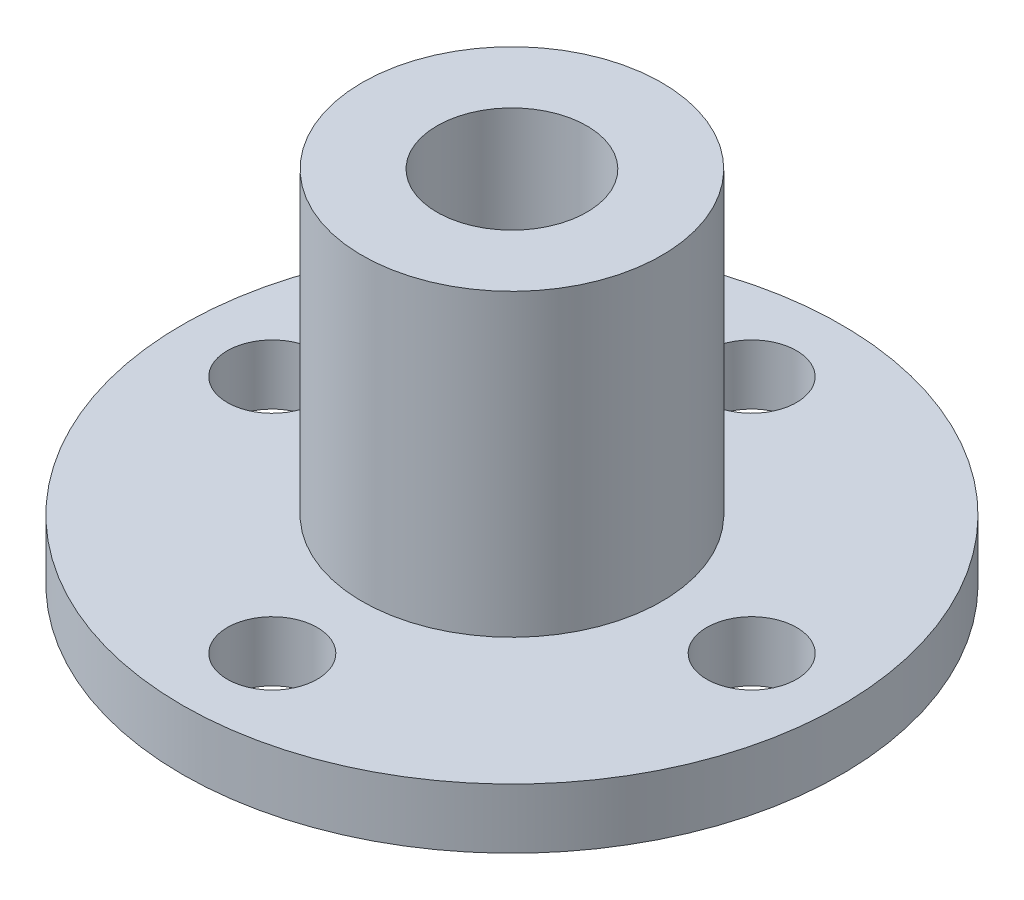
ISO-10303-21;
HEADER;
FILE_DESCRIPTION(('STEP AP214'),'2;1');
FILE_NAME('part.step','',(''),(''),'','','');
FILE_SCHEMA(('AUTOMOTIVE_DESIGN { 1 0 10303 214 1 1 1 1 }'));
ENDSEC;
DATA;
#1=APPLICATION_CONTEXT('core data for automotive mechanical design processes');
#2=APPLICATION_PROTOCOL_DEFINITION('international standard','automotive_design',2000,#1);
#3=PRODUCT_CONTEXT('',#1,'mechanical');
#4=PRODUCT('Part','Part','',(#3));
#5=PRODUCT_RELATED_PRODUCT_CATEGORY('part','',(#4));
#6=PRODUCT_DEFINITION_FORMATION('','',#4);
#7=PRODUCT_DEFINITION_CONTEXT('part definition',#1,'design');
#8=PRODUCT_DEFINITION('design','',#6,#7);
#9=PRODUCT_DEFINITION_SHAPE('','',#8);
#10=(LENGTH_UNIT() NAMED_UNIT(*) SI_UNIT(.MILLI.,.METRE.));
#11=(NAMED_UNIT(*) PLANE_ANGLE_UNIT() SI_UNIT($,.RADIAN.));
#12=(NAMED_UNIT(*) SI_UNIT($,.STERADIAN.) SOLID_ANGLE_UNIT());
#13=UNCERTAINTY_MEASURE_WITH_UNIT(LENGTH_MEASURE(1.E-05),#10,'distance_accuracy_value','');
#14=(GEOMETRIC_REPRESENTATION_CONTEXT(3) GLOBAL_UNCERTAINTY_ASSIGNED_CONTEXT((#13)) GLOBAL_UNIT_ASSIGNED_CONTEXT((#10,
#11,#12)) REPRESENTATION_CONTEXT('',''));
#15=CARTESIAN_POINT('',(0.,0.,0.));
#16=DIRECTION('',(0.,0.,1.));
#17=DIRECTION('',(1.,0.,0.));
#18=AXIS2_PLACEMENT_3D('',#15,#16,#17);
#19=CARTESIAN_POINT('',(0.,2.,0.));
#20=DIRECTION('',(0.,-1.,0.));
#21=DIRECTION('',(0.,0.,-1.));
#22=AXIS2_PLACEMENT_3D('',#19,#20,#21);
#23=CYLINDRICAL_SURFACE('',#22,11.);
#24=CARTESIAN_POINT('',(0.,2.,0.));
#25=DIRECTION('',(0.,1.,0.));
#26=DIRECTION('',(0.,0.,1.));
#27=AXIS2_PLACEMENT_3D('',#24,#25,#26);
#28=CIRCLE('',#27,11.);
#29=CARTESIAN_POINT('',(0.,2.,11.));
#30=VERTEX_POINT('',#29);
#31=EDGE_CURVE('E44',#30,#30,#28,.T.);
#32=ORIENTED_EDGE('',*,*,#31,.F.);
#33=EDGE_LOOP('',(#32));
#34=FACE_BOUND('',#33,.T.);
#35=CARTESIAN_POINT('',(0.,0.,0.));
#36=DIRECTION('',(0.,1.,0.));
#37=DIRECTION('',(0.,0.,1.));
#38=AXIS2_PLACEMENT_3D('',#35,#36,#37);
#39=CIRCLE('',#38,11.);
#40=CARTESIAN_POINT('',(0.,0.,11.));
#41=VERTEX_POINT('',#40);
#42=EDGE_CURVE('E49',#41,#41,#39,.T.);
#43=ORIENTED_EDGE('',*,*,#42,.T.);
#44=EDGE_LOOP('',(#43));
#45=FACE_BOUND('',#44,.T.);
#46=ADVANCED_FACE('F37',(#34,#45),#23,.T.);
#47=CARTESIAN_POINT('',(0.,2.,0.));
#48=DIRECTION('',(0.,1.,0.));
#49=DIRECTION('',(0.,0.,1.));
#50=AXIS2_PLACEMENT_3D('',#47,#48,#49);
#51=PLANE('',#50);
#52=CARTESIAN_POINT('',(-8.,2.,0.));
#53=DIRECTION('',(0.,1.,0.));
#54=DIRECTION('',(-1.,0.,0.));
#55=AXIS2_PLACEMENT_3D('',#52,#53,#54);
#56=CIRCLE('',#55,1.5);
#57=CARTESIAN_POINT('',(-9.5,2.,0.));
#58=VERTEX_POINT('',#57);
#59=EDGE_CURVE('E61',#58,#58,#56,.T.);
#60=ORIENTED_EDGE('',*,*,#59,.F.);
#61=EDGE_LOOP('',(#60));
#62=FACE_BOUND('',#61,.T.);
#63=CARTESIAN_POINT('',(-0.000999999999972068,2.,-8.001));
#64=DIRECTION('',(0.,1.,0.));
#65=DIRECTION('',(-1.,0.,0.));
#66=AXIS2_PLACEMENT_3D('',#63,#64,#65);
#67=CIRCLE('',#66,1.5);
#68=CARTESIAN_POINT('',(-1.50099999999997,2.,-8.001));
#69=VERTEX_POINT('',#68);
#70=EDGE_CURVE('E108',#69,#69,#67,.T.);
#71=ORIENTED_EDGE('',*,*,#70,.F.);
#72=EDGE_LOOP('',(#71));
#73=FACE_BOUND('',#72,.T.);
#74=CARTESIAN_POINT('',(8.,2.,-0.00199999999994414));
#75=DIRECTION('',(0.,1.,0.));
#76=DIRECTION('',(-1.,0.,0.));
#77=AXIS2_PLACEMENT_3D('',#74,#75,#76);
#78=CIRCLE('',#77,1.5);
#79=CARTESIAN_POINT('',(6.5,2.,-0.00199999999994414));
#80=VERTEX_POINT('',#79);
#81=EDGE_CURVE('E112',#80,#80,#78,.T.);
#82=ORIENTED_EDGE('',*,*,#81,.F.);
#83=EDGE_LOOP('',(#82));
#84=FACE_BOUND('',#83,.T.);
#85=CARTESIAN_POINT('',(0.000999999999916204,2.,7.999));
#86=DIRECTION('',(0.,1.,0.));
#87=DIRECTION('',(-1.,0.,0.));
#88=AXIS2_PLACEMENT_3D('',#85,#86,#87);
#89=CIRCLE('',#88,1.5);
#90=CARTESIAN_POINT('',(-1.49900000000008,2.,7.999));
#91=VERTEX_POINT('',#90);
#92=EDGE_CURVE('E116',#91,#91,#89,.T.);
#93=ORIENTED_EDGE('',*,*,#92,.F.);
#94=EDGE_LOOP('',(#93));
#95=FACE_BOUND('',#94,.T.);
#96=CARTESIAN_POINT('',(0.,2.,0.));
#97=DIRECTION('',(0.,1.,0.));
#98=DIRECTION('',(-1.,0.,0.));
#99=AXIS2_PLACEMENT_3D('',#96,#97,#98);
#100=CIRCLE('',#99,5.);
#101=CARTESIAN_POINT('',(-5.,2.,0.));
#102=VERTEX_POINT('',#101);
#103=EDGE_CURVE('E10',#102,#102,#100,.T.);
#104=ORIENTED_EDGE('',*,*,#103,.F.);
#105=EDGE_LOOP('',(#104));
#106=FACE_BOUND('',#105,.T.);
#107=ORIENTED_EDGE('',*,*,#31,.T.);
#108=EDGE_LOOP('',(#107));
#109=FACE_BOUND('',#108,.T.);
#110=ADVANCED_FACE('F86',(#62,#73,#84,#95,#106,#109),#51,.T.);
#111=CARTESIAN_POINT('',(0.,0.,0.));
#112=DIRECTION('',(0.,1.,0.));
#113=DIRECTION('',(0.,0.,1.));
#114=AXIS2_PLACEMENT_3D('',#111,#112,#113);
#115=PLANE('',#114);
#116=CARTESIAN_POINT('',(0.,0.,0.));
#117=DIRECTION('',(0.,1.,0.));
#118=DIRECTION('',(-1.,0.,0.));
#119=AXIS2_PLACEMENT_3D('',#116,#117,#118);
#120=CIRCLE('',#119,2.5);
#121=CARTESIAN_POINT('',(-2.5,0.,0.));
#122=VERTEX_POINT('',#121);
#123=EDGE_CURVE('E118',#122,#122,#120,.T.);
#124=ORIENTED_EDGE('',*,*,#123,.T.);
#125=EDGE_LOOP('',(#124));
#126=FACE_BOUND('',#125,.T.);
#127=CARTESIAN_POINT('',(-8.,0.,0.));
#128=DIRECTION('',(0.,1.,0.));
#129=DIRECTION('',(0.,0.,1.));
#130=AXIS2_PLACEMENT_3D('',#127,#128,#129);
#131=CIRCLE('',#130,1.5);
#132=CARTESIAN_POINT('',(-8.,0.,1.5));
#133=VERTEX_POINT('',#132);
#134=EDGE_CURVE('E40',#133,#133,#131,.T.);
#135=ORIENTED_EDGE('',*,*,#134,.T.);
#136=EDGE_LOOP('',(#135));
#137=FACE_BOUND('',#136,.T.);
#138=CARTESIAN_POINT('',(-0.000999999999972191,0.,-8.001));
#139=DIRECTION('',(0.,1.,0.));
#140=DIRECTION('',(0.,0.,1.));
#141=AXIS2_PLACEMENT_3D('',#138,#139,#140);
#142=CIRCLE('',#141,1.5);
#143=CARTESIAN_POINT('',(-0.000999999999972191,0.,-6.501));
#144=VERTEX_POINT('',#143);
#145=EDGE_CURVE('E63',#144,#144,#142,.T.);
#146=ORIENTED_EDGE('',*,*,#145,.T.);
#147=EDGE_LOOP('',(#146));
#148=FACE_BOUND('',#147,.T.);
#149=CARTESIAN_POINT('',(8.,0.,-0.00199999999994414));
#150=DIRECTION('',(0.,1.,0.));
#151=DIRECTION('',(0.,0.,1.));
#152=AXIS2_PLACEMENT_3D('',#149,#150,#151);
#153=CIRCLE('',#152,1.5);
#154=CARTESIAN_POINT('',(8.,0.,1.49800000000006));
#155=VERTEX_POINT('',#154);
#156=EDGE_CURVE('E60',#155,#155,#153,.T.);
#157=ORIENTED_EDGE('',*,*,#156,.T.);
#158=EDGE_LOOP('',(#157));
#159=FACE_BOUND('',#158,.T.);
#160=CARTESIAN_POINT('',(0.000999999999916082,0.,7.999));
#161=DIRECTION('',(0.,1.,0.));
#162=DIRECTION('',(0.,0.,1.));
#163=AXIS2_PLACEMENT_3D('',#160,#161,#162);
#164=CIRCLE('',#163,1.5);
#165=CARTESIAN_POINT('',(0.000999999999916082,0.,9.499));
#166=VERTEX_POINT('',#165);
#167=EDGE_CURVE('E57',#166,#166,#164,.T.);
#168=ORIENTED_EDGE('',*,*,#167,.T.);
#169=EDGE_LOOP('',(#168));
#170=FACE_BOUND('',#169,.T.);
#171=ORIENTED_EDGE('',*,*,#42,.F.);
#172=EDGE_LOOP('',(#171));
#173=FACE_BOUND('',#172,.T.);
#174=ADVANCED_FACE('F77',(#126,#137,#148,#159,#170,#173),#115,.F.);
#175=CARTESIAN_POINT('',(0.,12.,0.));
#176=DIRECTION('',(0.,-1.,0.));
#177=DIRECTION('',(1.,0.,0.));
#178=AXIS2_PLACEMENT_3D('',#175,#176,#177);
#179=CYLINDRICAL_SURFACE('',#178,5.);
#180=CARTESIAN_POINT('',(0.,12.,0.));
#181=DIRECTION('',(0.,1.,0.));
#182=DIRECTION('',(-1.,0.,0.));
#183=AXIS2_PLACEMENT_3D('',#180,#181,#182);
#184=CIRCLE('',#183,5.);
#185=CARTESIAN_POINT('',(-5.,12.,0.));
#186=VERTEX_POINT('',#185);
#187=EDGE_CURVE('E52',#186,#186,#184,.T.);
#188=ORIENTED_EDGE('',*,*,#187,.F.);
#189=EDGE_LOOP('',(#188));
#190=FACE_BOUND('',#189,.T.);
#191=ORIENTED_EDGE('',*,*,#103,.T.);
#192=EDGE_LOOP('',(#191));
#193=FACE_BOUND('',#192,.T.);
#194=ADVANCED_FACE('F75',(#190,#193),#179,.T.);
#195=CARTESIAN_POINT('',(0.,12.,0.));
#196=DIRECTION('',(0.,1.,0.));
#197=DIRECTION('',(-1.,0.,0.));
#198=AXIS2_PLACEMENT_3D('',#195,#196,#197);
#199=PLANE('',#198);
#200=CARTESIAN_POINT('',(0.,12.,0.));
#201=DIRECTION('',(0.,1.,0.));
#202=DIRECTION('',(-1.,0.,0.));
#203=AXIS2_PLACEMENT_3D('',#200,#201,#202);
#204=CIRCLE('',#203,2.5);
#205=CARTESIAN_POINT('',(-2.5,12.,0.));
#206=VERTEX_POINT('',#205);
#207=EDGE_CURVE('E121',#206,#206,#204,.T.);
#208=ORIENTED_EDGE('',*,*,#207,.F.);
#209=EDGE_LOOP('',(#208));
#210=FACE_BOUND('',#209,.T.);
#211=ORIENTED_EDGE('',*,*,#187,.T.);
#212=EDGE_LOOP('',(#211));
#213=FACE_BOUND('',#212,.T.);
#214=ADVANCED_FACE('F73',(#210,#213),#199,.T.);
#215=CARTESIAN_POINT('',(0.000999999999915592,-8.,7.999));
#216=DIRECTION('',(0.,1.,0.));
#217=DIRECTION('',(-1.,0.,0.));
#218=AXIS2_PLACEMENT_3D('',#215,#216,#217);
#219=CYLINDRICAL_SURFACE('',#218,1.5);
#220=ORIENTED_EDGE('',*,*,#92,.T.);
#221=EDGE_LOOP('',(#220));
#222=FACE_BOUND('',#221,.T.);
#223=ORIENTED_EDGE('',*,*,#167,.F.);
#224=EDGE_LOOP('',(#223));
#225=FACE_BOUND('',#224,.T.);
#226=ADVANCED_FACE('F83',(#222,#225),#219,.F.);
#227=CARTESIAN_POINT('',(8.,-8.,-0.00199999999994414));
#228=DIRECTION('',(0.,1.,0.));
#229=DIRECTION('',(-1.,0.,0.));
#230=AXIS2_PLACEMENT_3D('',#227,#228,#229);
#231=CYLINDRICAL_SURFACE('',#230,1.5);
#232=ORIENTED_EDGE('',*,*,#81,.T.);
#233=EDGE_LOOP('',(#232));
#234=FACE_BOUND('',#233,.T.);
#235=ORIENTED_EDGE('',*,*,#156,.F.);
#236=EDGE_LOOP('',(#235));
#237=FACE_BOUND('',#236,.T.);
#238=ADVANCED_FACE('F144',(#234,#237),#231,.F.);
#239=CARTESIAN_POINT('',(-0.000999999999972681,-8.,-8.001));
#240=DIRECTION('',(0.,1.,0.));
#241=DIRECTION('',(-1.,0.,0.));
#242=AXIS2_PLACEMENT_3D('',#239,#240,#241);
#243=CYLINDRICAL_SURFACE('',#242,1.5);
#244=ORIENTED_EDGE('',*,*,#70,.T.);
#245=EDGE_LOOP('',(#244));
#246=FACE_BOUND('',#245,.T.);
#247=ORIENTED_EDGE('',*,*,#145,.F.);
#248=EDGE_LOOP('',(#247));
#249=FACE_BOUND('',#248,.T.);
#250=ADVANCED_FACE('F137',(#246,#249),#243,.F.);
#251=CARTESIAN_POINT('',(-8.,-8.,0.));
#252=DIRECTION('',(0.,1.,0.));
#253=DIRECTION('',(-1.,0.,0.));
#254=AXIS2_PLACEMENT_3D('',#251,#252,#253);
#255=CYLINDRICAL_SURFACE('',#254,1.5);
#256=ORIENTED_EDGE('',*,*,#59,.T.);
#257=EDGE_LOOP('',(#256));
#258=FACE_BOUND('',#257,.T.);
#259=ORIENTED_EDGE('',*,*,#134,.F.);
#260=EDGE_LOOP('',(#259));
#261=FACE_BOUND('',#260,.T.);
#262=ADVANCED_FACE('F131',(#258,#261),#255,.F.);
#263=CARTESIAN_POINT('',(0.,0.,0.));
#264=DIRECTION('',(0.,1.,0.));
#265=DIRECTION('',(-1.,0.,0.));
#266=AXIS2_PLACEMENT_3D('',#263,#264,#265);
#267=CYLINDRICAL_SURFACE('',#266,2.5);
#268=ORIENTED_EDGE('',*,*,#123,.F.);
#269=EDGE_LOOP('',(#268));
#270=FACE_BOUND('',#269,.T.);
#271=ORIENTED_EDGE('',*,*,#207,.T.);
#272=EDGE_LOOP('',(#271));
#273=FACE_BOUND('',#272,.T.);
#274=ADVANCED_FACE('F129',(#270,#273),#267,.F.);
#275=CLOSED_SHELL('',(#46,#110,#174,#194,#214,#226,#238,#250,#262,#274));
#276=MANIFOLD_SOLID_BREP('B2',#275);
#277=ADVANCED_BREP_SHAPE_REPRESENTATION('',(#18,#276),#14);
#278=SHAPE_DEFINITION_REPRESENTATION(#9,#277);
ENDSEC;
END-ISO-10303-21;
